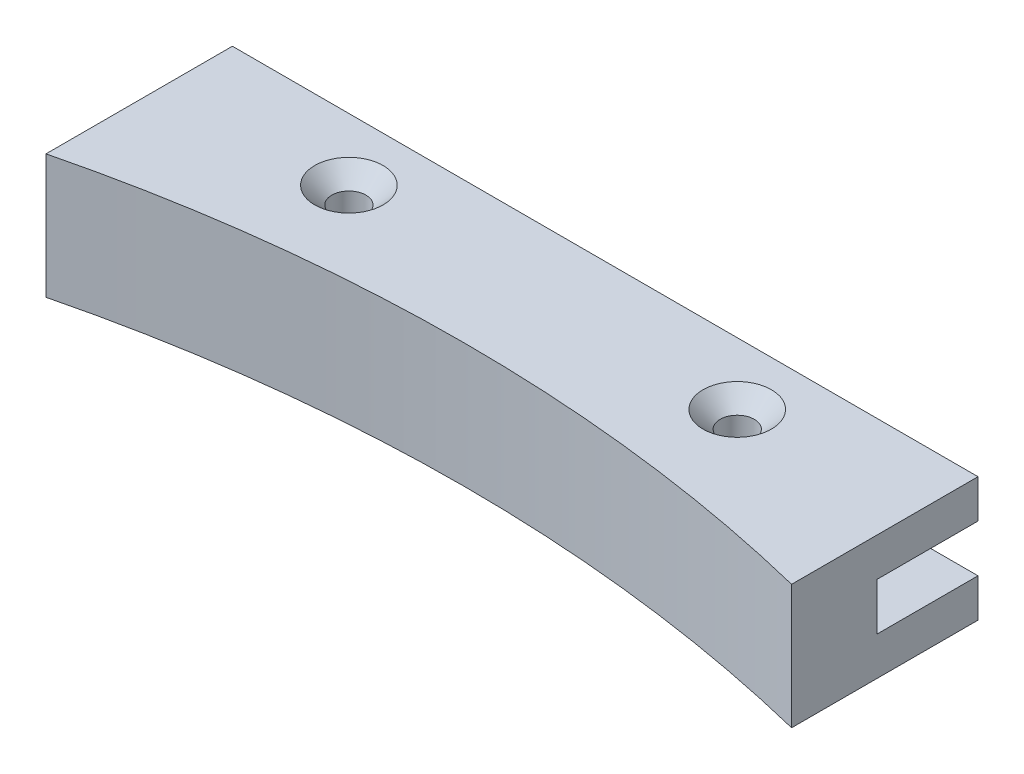
ISO-10303-21;
HEADER;
FILE_DESCRIPTION(('STEP AP214'),'2;1');
FILE_NAME('part.step','',(''),(''),'','','');
FILE_SCHEMA(('AUTOMOTIVE_DESIGN { 1 0 10303 214 1 1 1 1 }'));
ENDSEC;
DATA;
#1=APPLICATION_CONTEXT('core data for automotive mechanical design processes');
#2=APPLICATION_PROTOCOL_DEFINITION('international standard','automotive_design',2000,#1);
#3=PRODUCT_CONTEXT('',#1,'mechanical');
#4=PRODUCT('Part','Part','',(#3));
#5=PRODUCT_RELATED_PRODUCT_CATEGORY('part','',(#4));
#6=PRODUCT_DEFINITION_FORMATION('','',#4);
#7=PRODUCT_DEFINITION_CONTEXT('part definition',#1,'design');
#8=PRODUCT_DEFINITION('design','',#6,#7);
#9=PRODUCT_DEFINITION_SHAPE('','',#8);
#10=(LENGTH_UNIT() NAMED_UNIT(*) SI_UNIT(.MILLI.,.METRE.));
#11=(NAMED_UNIT(*) PLANE_ANGLE_UNIT() SI_UNIT($,.RADIAN.));
#12=(NAMED_UNIT(*) SI_UNIT($,.STERADIAN.) SOLID_ANGLE_UNIT());
#13=UNCERTAINTY_MEASURE_WITH_UNIT(LENGTH_MEASURE(1.E-05),#10,'distance_accuracy_value','');
#14=(GEOMETRIC_REPRESENTATION_CONTEXT(3) GLOBAL_UNCERTAINTY_ASSIGNED_CONTEXT((#13)) GLOBAL_UNIT_ASSIGNED_CONTEXT((#10,
#11,#12)) REPRESENTATION_CONTEXT('',''));
#15=CARTESIAN_POINT('',(0.,0.,0.));
#16=DIRECTION('',(0.,0.,1.));
#17=DIRECTION('',(1.,0.,0.));
#18=AXIS2_PLACEMENT_3D('',#15,#16,#17);
#19=CARTESIAN_POINT('',(-24.,4.,0.));
#20=DIRECTION('',(0.,0.,1.));
#21=DIRECTION('',(1.,0.,0.));
#22=AXIS2_PLACEMENT_3D('',#19,#20,#21);
#23=PLANE('',#22);
#24=DIRECTION('',(0.,-1.,0.));
#25=VECTOR('',#24,1.);
#26=CARTESIAN_POINT('',(24.,4.,0.));
#27=LINE('',#26,#25);
#28=CARTESIAN_POINT('',(24.,4.,0.));
#29=VERTEX_POINT('',#28);
#30=CARTESIAN_POINT('',(24.,1.525,0.));
#31=VERTEX_POINT('',#30);
#32=EDGE_CURVE('E47',#29,#31,#27,.T.);
#33=ORIENTED_EDGE('',*,*,#32,.T.);
#34=DIRECTION('',(-1.,0.,0.));
#35=VECTOR('',#34,1.);
#36=CARTESIAN_POINT('',(24.,1.525,0.));
#37=LINE('',#36,#35);
#38=CARTESIAN_POINT('',(-24.,1.525,0.));
#39=VERTEX_POINT('',#38);
#40=EDGE_CURVE('E143',#31,#39,#37,.T.);
#41=ORIENTED_EDGE('',*,*,#40,.T.);
#42=DIRECTION('',(0.,-1.,0.));
#43=VECTOR('',#42,1.);
#44=CARTESIAN_POINT('',(-24.,4.,0.));
#45=LINE('',#44,#43);
#46=CARTESIAN_POINT('',(-24.,4.,0.));
#47=VERTEX_POINT('',#46);
#48=EDGE_CURVE('E134',#47,#39,#45,.T.);
#49=ORIENTED_EDGE('',*,*,#48,.F.);
#50=DIRECTION('',(-1.,0.,0.));
#51=VECTOR('',#50,1.);
#52=CARTESIAN_POINT('',(-24.,4.,0.));
#53=LINE('',#52,#51);
#54=EDGE_CURVE('E183',#29,#47,#53,.T.);
#55=ORIENTED_EDGE('',*,*,#54,.F.);
#56=EDGE_LOOP('',(#33,#41,#49,#55));
#57=FACE_BOUND('',#56,.T.);
#58=ADVANCED_FACE('F38',(#57),#23,.F.);
#59=CARTESIAN_POINT('',(12.5,4.,3.99999999999999));
#60=DIRECTION('',(0.,1.,0.));
#61=DIRECTION('',(0.,0.,1.));
#62=AXIS2_PLACEMENT_3D('',#59,#60,#61);
#63=CYLINDRICAL_SURFACE('',#62,1.1);
#64=CARTESIAN_POINT('',(12.5,1.525,3.99999999999999));
#65=DIRECTION('',(0.,1.,0.));
#66=DIRECTION('',(0.,0.,1.));
#67=AXIS2_PLACEMENT_3D('',#64,#65,#66);
#68=CIRCLE('',#67,1.1);
#69=CARTESIAN_POINT('',(12.5,1.525,5.09999999999999));
#70=VERTEX_POINT('',#69);
#71=EDGE_CURVE('E158',#70,#70,#68,.F.);
#72=ORIENTED_EDGE('',*,*,#71,.T.);
#73=EDGE_LOOP('',(#72));
#74=FACE_BOUND('',#73,.T.);
#75=CARTESIAN_POINT('',(12.5,2.9,3.99999999999999));
#76=DIRECTION('',(0.,1.,0.));
#77=DIRECTION('',(0.,0.,1.));
#78=AXIS2_PLACEMENT_3D('',#75,#76,#77);
#79=CIRCLE('',#78,1.1);
#80=CARTESIAN_POINT('',(12.5,2.9,5.09999999999999));
#81=VERTEX_POINT('',#80);
#82=EDGE_CURVE('E173',#81,#81,#79,.T.);
#83=ORIENTED_EDGE('',*,*,#82,.T.);
#84=EDGE_LOOP('',(#83));
#85=FACE_BOUND('',#84,.T.);
#86=ADVANCED_FACE('F222',(#74,#85),#63,.F.);
#87=CARTESIAN_POINT('',(-12.5,4.,3.99999999999999));
#88=DIRECTION('',(0.,1.,0.));
#89=DIRECTION('',(0.,0.,1.));
#90=AXIS2_PLACEMENT_3D('',#87,#88,#89);
#91=CYLINDRICAL_SURFACE('',#90,1.1);
#92=CARTESIAN_POINT('',(-12.5,1.525,3.99999999999999));
#93=DIRECTION('',(0.,1.,0.));
#94=DIRECTION('',(0.,0.,1.));
#95=AXIS2_PLACEMENT_3D('',#92,#93,#94);
#96=CIRCLE('',#95,1.1);
#97=CARTESIAN_POINT('',(-12.5,1.525,5.09999999999999));
#98=VERTEX_POINT('',#97);
#99=EDGE_CURVE('E42',#98,#98,#96,.F.);
#100=ORIENTED_EDGE('',*,*,#99,.T.);
#101=EDGE_LOOP('',(#100));
#102=FACE_BOUND('',#101,.T.);
#103=CARTESIAN_POINT('',(-12.5,2.9,3.99999999999999));
#104=DIRECTION('',(0.,1.,0.));
#105=DIRECTION('',(0.,0.,1.));
#106=AXIS2_PLACEMENT_3D('',#103,#104,#105);
#107=CIRCLE('',#106,1.1);
#108=CARTESIAN_POINT('',(-12.5,2.9,5.09999999999999));
#109=VERTEX_POINT('',#108);
#110=EDGE_CURVE('E164',#109,#109,#107,.T.);
#111=ORIENTED_EDGE('',*,*,#110,.T.);
#112=EDGE_LOOP('',(#111));
#113=FACE_BOUND('',#112,.T.);
#114=ADVANCED_FACE('F225',(#102,#113),#91,.F.);
#115=CARTESIAN_POINT('',(0.,4.,109.077288796093));
#116=DIRECTION('',(0.,-1.,0.));
#117=DIRECTION('',(0.,0.,-1.));
#118=AXIS2_PLACEMENT_3D('',#115,#116,#117);
#119=CYLINDRICAL_SURFACE('',#118,100.);
#120=CARTESIAN_POINT('',(0.,-4.,109.077288796093));
#121=DIRECTION('',(0.,-1.,0.));
#122=DIRECTION('',(0.,0.,-1.));
#123=AXIS2_PLACEMENT_3D('',#120,#121,#122);
#124=CIRCLE('',#123,100.);
#125=CARTESIAN_POINT('',(-24.,-4.,12.));
#126=VERTEX_POINT('',#125);
#127=CARTESIAN_POINT('',(24.,-4.,12.));
#128=VERTEX_POINT('',#127);
#129=EDGE_CURVE('E179',#126,#128,#124,.T.);
#130=ORIENTED_EDGE('',*,*,#129,.T.);
#131=DIRECTION('',(0.,-1.,0.));
#132=VECTOR('',#131,1.);
#133=CARTESIAN_POINT('',(24.,4.,12.));
#134=LINE('',#133,#132);
#135=CARTESIAN_POINT('',(24.,4.,12.));
#136=VERTEX_POINT('',#135);
#137=EDGE_CURVE('E11',#136,#128,#134,.T.);
#138=ORIENTED_EDGE('',*,*,#137,.F.);
#139=CARTESIAN_POINT('',(0.,4.,109.077288796093));
#140=DIRECTION('',(0.,-1.,0.));
#141=DIRECTION('',(0.,0.,-1.));
#142=AXIS2_PLACEMENT_3D('',#139,#140,#141);
#143=CIRCLE('',#142,100.);
#144=CARTESIAN_POINT('',(-24.,4.,12.));
#145=VERTEX_POINT('',#144);
#146=EDGE_CURVE('E180',#145,#136,#143,.T.);
#147=ORIENTED_EDGE('',*,*,#146,.F.);
#148=DIRECTION('',(0.,-1.,0.));
#149=VECTOR('',#148,1.);
#150=CARTESIAN_POINT('',(-24.,4.,12.));
#151=LINE('',#150,#149);
#152=EDGE_CURVE('E186',#145,#126,#151,.T.);
#153=ORIENTED_EDGE('',*,*,#152,.T.);
#154=EDGE_LOOP('',(#130,#138,#147,#153));
#155=FACE_BOUND('',#154,.T.);
#156=ADVANCED_FACE('F40',(#155),#119,.F.);
#157=CARTESIAN_POINT('',(24.,4.,0.));
#158=DIRECTION('',(-1.,0.,0.));
#159=DIRECTION('',(0.,0.,1.));
#160=AXIS2_PLACEMENT_3D('',#157,#158,#159);
#161=PLANE('',#160);
#162=DIRECTION('',(0.,1.,0.));
#163=VECTOR('',#162,1.);
#164=CARTESIAN_POINT('',(24.,-1.525,6.49999999999999));
#165=LINE('',#164,#163);
#166=CARTESIAN_POINT('',(24.,-1.525,6.49999999999999));
#167=VERTEX_POINT('',#166);
#168=CARTESIAN_POINT('',(24.,1.525,6.49999999999999));
#169=VERTEX_POINT('',#168);
#170=EDGE_CURVE('E119',#167,#169,#165,.T.);
#171=ORIENTED_EDGE('',*,*,#170,.T.);
#172=DIRECTION('',(0.,0.,-1.));
#173=VECTOR('',#172,1.);
#174=CARTESIAN_POINT('',(24.,1.525,0.));
#175=LINE('',#174,#173);
#176=EDGE_CURVE('E129',#169,#31,#175,.T.);
#177=ORIENTED_EDGE('',*,*,#176,.T.);
#178=ORIENTED_EDGE('',*,*,#32,.F.);
#179=DIRECTION('',(0.,0.,-1.));
#180=VECTOR('',#179,1.);
#181=CARTESIAN_POINT('',(24.,4.,0.));
#182=LINE('',#181,#180);
#183=EDGE_CURVE('E91',#136,#29,#182,.T.);
#184=ORIENTED_EDGE('',*,*,#183,.F.);
#185=ORIENTED_EDGE('',*,*,#137,.T.);
#186=DIRECTION('',(0.,0.,-1.));
#187=VECTOR('',#186,1.);
#188=CARTESIAN_POINT('',(24.,-4.,0.));
#189=LINE('',#188,#187);
#190=CARTESIAN_POINT('',(24.,-4.,0.));
#191=VERTEX_POINT('',#190);
#192=EDGE_CURVE('E132',#128,#191,#189,.T.);
#193=ORIENTED_EDGE('',*,*,#192,.T.);
#194=CARTESIAN_POINT('',(24.,-1.525,0.));
#195=VERTEX_POINT('',#194);
#196=EDGE_CURVE('E126',#195,#191,#27,.T.);
#197=ORIENTED_EDGE('',*,*,#196,.F.);
#198=DIRECTION('',(0.,0.,1.));
#199=VECTOR('',#198,1.);
#200=CARTESIAN_POINT('',(24.,-1.525,0.));
#201=LINE('',#200,#199);
#202=EDGE_CURVE('E112',#195,#167,#201,.T.);
#203=ORIENTED_EDGE('',*,*,#202,.T.);
#204=EDGE_LOOP('',(#171,#177,#178,#184,#185,#193,#197,#203));
#205=FACE_BOUND('',#204,.T.);
#206=ADVANCED_FACE('F131',(#205),#161,.F.);
#207=CARTESIAN_POINT('',(-24.,-1.525,0.));
#208=VERTEX_POINT('',#207);
#209=CARTESIAN_POINT('',(-24.,-4.,0.));
#210=VERTEX_POINT('',#209);
#211=EDGE_CURVE('E128',#208,#210,#45,.T.);
#212=ORIENTED_EDGE('',*,*,#211,.F.);
#213=DIRECTION('',(-1.,0.,0.));
#214=VECTOR('',#213,1.);
#215=CARTESIAN_POINT('',(24.,-1.525,0.));
#216=LINE('',#215,#214);
#217=EDGE_CURVE('E55',#195,#208,#216,.T.);
#218=ORIENTED_EDGE('',*,*,#217,.F.);
#219=ORIENTED_EDGE('',*,*,#196,.T.);
#220=DIRECTION('',(-1.,0.,0.));
#221=VECTOR('',#220,1.);
#222=CARTESIAN_POINT('',(-24.,-4.,0.));
#223=LINE('',#222,#221);
#224=EDGE_CURVE('E190',#191,#210,#223,.T.);
#225=ORIENTED_EDGE('',*,*,#224,.T.);
#226=EDGE_LOOP('',(#212,#218,#219,#225));
#227=FACE_BOUND('',#226,.T.);
#228=ADVANCED_FACE('F124',(#227),#23,.F.);
#229=CARTESIAN_POINT('',(-24.,4.,0.));
#230=DIRECTION('',(1.,0.,0.));
#231=DIRECTION('',(0.,0.,-1.));
#232=AXIS2_PLACEMENT_3D('',#229,#230,#231);
#233=PLANE('',#232);
#234=ORIENTED_EDGE('',*,*,#48,.T.);
#235=DIRECTION('',(0.,0.,-1.));
#236=VECTOR('',#235,1.);
#237=CARTESIAN_POINT('',(-24.,1.525,0.));
#238=LINE('',#237,#236);
#239=CARTESIAN_POINT('',(-24.,1.525,6.50000000000001));
#240=VERTEX_POINT('',#239);
#241=EDGE_CURVE('E120',#240,#39,#238,.T.);
#242=ORIENTED_EDGE('',*,*,#241,.F.);
#243=DIRECTION('',(0.,1.,0.));
#244=VECTOR('',#243,1.);
#245=CARTESIAN_POINT('',(-24.,-1.525,6.50000000000001));
#246=LINE('',#245,#244);
#247=CARTESIAN_POINT('',(-24.,-1.525,6.50000000000001));
#248=VERTEX_POINT('',#247);
#249=EDGE_CURVE('E207',#248,#240,#246,.T.);
#250=ORIENTED_EDGE('',*,*,#249,.F.);
#251=DIRECTION('',(0.,0.,1.));
#252=VECTOR('',#251,1.);
#253=CARTESIAN_POINT('',(-24.,-1.525,0.));
#254=LINE('',#253,#252);
#255=EDGE_CURVE('E197',#208,#248,#254,.T.);
#256=ORIENTED_EDGE('',*,*,#255,.F.);
#257=ORIENTED_EDGE('',*,*,#211,.T.);
#258=DIRECTION('',(0.,0.,1.));
#259=VECTOR('',#258,1.);
#260=CARTESIAN_POINT('',(-24.,-4.,0.));
#261=LINE('',#260,#259);
#262=EDGE_CURVE('E84',#210,#126,#261,.T.);
#263=ORIENTED_EDGE('',*,*,#262,.T.);
#264=ORIENTED_EDGE('',*,*,#152,.F.);
#265=DIRECTION('',(0.,0.,1.));
#266=VECTOR('',#265,1.);
#267=CARTESIAN_POINT('',(-24.,4.,0.));
#268=LINE('',#267,#266);
#269=EDGE_CURVE('E64',#47,#145,#268,.T.);
#270=ORIENTED_EDGE('',*,*,#269,.F.);
#271=EDGE_LOOP('',(#234,#242,#250,#256,#257,#263,#264,#270));
#272=FACE_BOUND('',#271,.T.);
#273=ADVANCED_FACE('F195',(#272),#233,.F.);
#274=CARTESIAN_POINT('',(0.,4.,109.077288796093));
#275=DIRECTION('',(0.,-1.,0.));
#276=DIRECTION('',(0.,0.,-1.));
#277=AXIS2_PLACEMENT_3D('',#274,#275,#276);
#278=PLANE('',#277);
#279=CARTESIAN_POINT('',(-12.5,4.,3.99999999999999));
#280=DIRECTION('',(0.,1.,0.));
#281=DIRECTION('',(0.,0.,1.));
#282=AXIS2_PLACEMENT_3D('',#279,#280,#281);
#283=CIRCLE('',#282,2.2);
#284=CARTESIAN_POINT('',(-12.5,4.,6.19999999999999));
#285=VERTEX_POINT('',#284);
#286=EDGE_CURVE('E161',#285,#285,#283,.T.);
#287=ORIENTED_EDGE('',*,*,#286,.F.);
#288=EDGE_LOOP('',(#287));
#289=FACE_BOUND('',#288,.T.);
#290=CARTESIAN_POINT('',(12.5,4.,3.99999999999999));
#291=DIRECTION('',(0.,1.,0.));
#292=DIRECTION('',(0.,0.,1.));
#293=AXIS2_PLACEMENT_3D('',#290,#291,#292);
#294=CIRCLE('',#293,2.2);
#295=CARTESIAN_POINT('',(12.5,4.,6.19999999999999));
#296=VERTEX_POINT('',#295);
#297=EDGE_CURVE('E170',#296,#296,#294,.T.);
#298=ORIENTED_EDGE('',*,*,#297,.F.);
#299=EDGE_LOOP('',(#298));
#300=FACE_BOUND('',#299,.T.);
#301=ORIENTED_EDGE('',*,*,#146,.T.);
#302=ORIENTED_EDGE('',*,*,#183,.T.);
#303=ORIENTED_EDGE('',*,*,#54,.T.);
#304=ORIENTED_EDGE('',*,*,#269,.T.);
#305=EDGE_LOOP('',(#301,#302,#303,#304));
#306=FACE_BOUND('',#305,.T.);
#307=ADVANCED_FACE('F201',(#289,#300,#306),#278,.F.);
#308=CARTESIAN_POINT('',(0.,-4.,109.077288796093));
#309=DIRECTION('',(0.,-1.,0.));
#310=DIRECTION('',(0.,0.,-1.));
#311=AXIS2_PLACEMENT_3D('',#308,#309,#310);
#312=PLANE('',#311);
#313=CARTESIAN_POINT('',(-12.5,-4.,3.99999999999999));
#314=DIRECTION('',(0.,1.,0.));
#315=DIRECTION('',(0.,0.,1.));
#316=AXIS2_PLACEMENT_3D('',#313,#314,#315);
#317=CIRCLE('',#316,1.1);
#318=CARTESIAN_POINT('',(-12.5,-4.,5.09999999999999));
#319=VERTEX_POINT('',#318);
#320=EDGE_CURVE('E167',#319,#319,#317,.T.);
#321=ORIENTED_EDGE('',*,*,#320,.T.);
#322=EDGE_LOOP('',(#321));
#323=FACE_BOUND('',#322,.T.);
#324=CARTESIAN_POINT('',(12.5,-4.,3.99999999999999));
#325=DIRECTION('',(0.,1.,0.));
#326=DIRECTION('',(0.,0.,1.));
#327=AXIS2_PLACEMENT_3D('',#324,#325,#326);
#328=CIRCLE('',#327,1.1);
#329=CARTESIAN_POINT('',(12.5,-4.,5.09999999999999));
#330=VERTEX_POINT('',#329);
#331=EDGE_CURVE('E176',#330,#330,#328,.T.);
#332=ORIENTED_EDGE('',*,*,#331,.T.);
#333=EDGE_LOOP('',(#332));
#334=FACE_BOUND('',#333,.T.);
#335=ORIENTED_EDGE('',*,*,#129,.F.);
#336=ORIENTED_EDGE('',*,*,#262,.F.);
#337=ORIENTED_EDGE('',*,*,#224,.F.);
#338=ORIENTED_EDGE('',*,*,#192,.F.);
#339=EDGE_LOOP('',(#335,#336,#337,#338));
#340=FACE_BOUND('',#339,.T.);
#341=ADVANCED_FACE('F199',(#323,#334,#340),#312,.T.);
#342=CARTESIAN_POINT('',(12.5,-1.525,3.99999999999999));
#343=DIRECTION('',(0.,-1.,0.));
#344=DIRECTION('',(0.,0.,-1.));
#345=AXIS2_PLACEMENT_3D('',#342,#343,#344);
#346=CIRCLE('',#345,1.1);
#347=CARTESIAN_POINT('',(12.5,-1.525,2.89999999999999));
#348=VERTEX_POINT('',#347);
#349=EDGE_CURVE('E142',#348,#348,#346,.F.);
#350=ORIENTED_EDGE('',*,*,#349,.T.);
#351=EDGE_LOOP('',(#350));
#352=FACE_BOUND('',#351,.T.);
#353=ORIENTED_EDGE('',*,*,#331,.F.);
#354=EDGE_LOOP('',(#353));
#355=FACE_BOUND('',#354,.T.);
#356=ADVANCED_FACE('F227',(#352,#355),#63,.F.);
#357=CARTESIAN_POINT('',(12.5,4.,3.99999999999999));
#358=DIRECTION('',(0.,1.,0.));
#359=DIRECTION('',(0.,0.,1.));
#360=AXIS2_PLACEMENT_3D('',#357,#358,#359);
#361=CONICAL_SURFACE('',#360,2.2,0.785398163397449);
#362=ORIENTED_EDGE('',*,*,#82,.F.);
#363=EDGE_LOOP('',(#362));
#364=FACE_BOUND('',#363,.T.);
#365=ORIENTED_EDGE('',*,*,#297,.T.);
#366=EDGE_LOOP('',(#365));
#367=FACE_BOUND('',#366,.T.);
#368=ADVANCED_FACE('F230',(#364,#367),#361,.F.);
#369=CARTESIAN_POINT('',(-12.5,-1.525,3.99999999999999));
#370=DIRECTION('',(0.,-1.,0.));
#371=DIRECTION('',(0.,0.,-1.));
#372=AXIS2_PLACEMENT_3D('',#369,#370,#371);
#373=CIRCLE('',#372,1.1);
#374=CARTESIAN_POINT('',(-12.5,-1.525,2.89999999999999));
#375=VERTEX_POINT('',#374);
#376=EDGE_CURVE('E140',#375,#375,#373,.F.);
#377=ORIENTED_EDGE('',*,*,#376,.T.);
#378=EDGE_LOOP('',(#377));
#379=FACE_BOUND('',#378,.T.);
#380=ORIENTED_EDGE('',*,*,#320,.F.);
#381=EDGE_LOOP('',(#380));
#382=FACE_BOUND('',#381,.T.);
#383=ADVANCED_FACE('F233',(#379,#382),#91,.F.);
#384=CARTESIAN_POINT('',(-12.5,4.,3.99999999999999));
#385=DIRECTION('',(0.,1.,0.));
#386=DIRECTION('',(0.,0.,1.));
#387=AXIS2_PLACEMENT_3D('',#384,#385,#386);
#388=CONICAL_SURFACE('',#387,2.2,0.785398163397449);
#389=ORIENTED_EDGE('',*,*,#110,.F.);
#390=EDGE_LOOP('',(#389));
#391=FACE_BOUND('',#390,.T.);
#392=ORIENTED_EDGE('',*,*,#286,.T.);
#393=EDGE_LOOP('',(#392));
#394=FACE_BOUND('',#393,.T.);
#395=ADVANCED_FACE('F217',(#391,#394),#388,.F.);
#396=CARTESIAN_POINT('',(24.,1.525,0.));
#397=DIRECTION('',(0.,1.,0.));
#398=DIRECTION('',(0.,0.,1.));
#399=AXIS2_PLACEMENT_3D('',#396,#397,#398);
#400=PLANE('',#399);
#401=ORIENTED_EDGE('',*,*,#99,.F.);
#402=EDGE_LOOP('',(#401));
#403=FACE_BOUND('',#402,.T.);
#404=ORIENTED_EDGE('',*,*,#241,.T.);
#405=ORIENTED_EDGE('',*,*,#40,.F.);
#406=ORIENTED_EDGE('',*,*,#176,.F.);
#407=DIRECTION('',(-1.,0.,0.));
#408=VECTOR('',#407,1.);
#409=CARTESIAN_POINT('',(24.,1.525,6.49999999999999));
#410=LINE('',#409,#408);
#411=EDGE_CURVE('E149',#169,#240,#410,.T.);
#412=ORIENTED_EDGE('',*,*,#411,.T.);
#413=EDGE_LOOP('',(#404,#405,#406,#412));
#414=FACE_BOUND('',#413,.T.);
#415=ORIENTED_EDGE('',*,*,#71,.F.);
#416=EDGE_LOOP('',(#415));
#417=FACE_BOUND('',#416,.T.);
#418=ADVANCED_FACE('F214',(#403,#414,#417),#400,.F.);
#419=CARTESIAN_POINT('',(24.,-1.525,0.));
#420=DIRECTION('',(0.,-1.,0.));
#421=DIRECTION('',(0.,0.,-1.));
#422=AXIS2_PLACEMENT_3D('',#419,#420,#421);
#423=PLANE('',#422);
#424=ORIENTED_EDGE('',*,*,#376,.F.);
#425=EDGE_LOOP('',(#424));
#426=FACE_BOUND('',#425,.T.);
#427=ORIENTED_EDGE('',*,*,#255,.T.);
#428=DIRECTION('',(-1.,0.,0.));
#429=VECTOR('',#428,1.);
#430=CARTESIAN_POINT('',(24.,-1.525,6.49999999999999));
#431=LINE('',#430,#429);
#432=EDGE_CURVE('E115',#167,#248,#431,.T.);
#433=ORIENTED_EDGE('',*,*,#432,.F.);
#434=ORIENTED_EDGE('',*,*,#202,.F.);
#435=ORIENTED_EDGE('',*,*,#217,.T.);
#436=EDGE_LOOP('',(#427,#433,#434,#435));
#437=FACE_BOUND('',#436,.T.);
#438=ORIENTED_EDGE('',*,*,#349,.F.);
#439=EDGE_LOOP('',(#438));
#440=FACE_BOUND('',#439,.T.);
#441=ADVANCED_FACE('F113',(#426,#437,#440),#423,.F.);
#442=CARTESIAN_POINT('',(24.,-1.525,6.49999999999999));
#443=DIRECTION('',(0.,0.,1.));
#444=DIRECTION('',(1.,0.,0.));
#445=AXIS2_PLACEMENT_3D('',#442,#443,#444);
#446=PLANE('',#445);
#447=ORIENTED_EDGE('',*,*,#249,.T.);
#448=ORIENTED_EDGE('',*,*,#411,.F.);
#449=ORIENTED_EDGE('',*,*,#170,.F.);
#450=ORIENTED_EDGE('',*,*,#432,.T.);
#451=EDGE_LOOP('',(#447,#448,#449,#450));
#452=FACE_BOUND('',#451,.T.);
#453=ADVANCED_FACE('F213',(#452),#446,.F.);
#454=CLOSED_SHELL('',(#58,#86,#114,#156,#206,#228,#273,#307,#341,#356,#368,#383,#395,#418,#441,#453));
#455=MANIFOLD_SOLID_BREP('B2',#454);
#456=ADVANCED_BREP_SHAPE_REPRESENTATION('',(#18,#455),#14);
#457=SHAPE_DEFINITION_REPRESENTATION(#9,#456);
ENDSEC;
END-ISO-10303-21;
